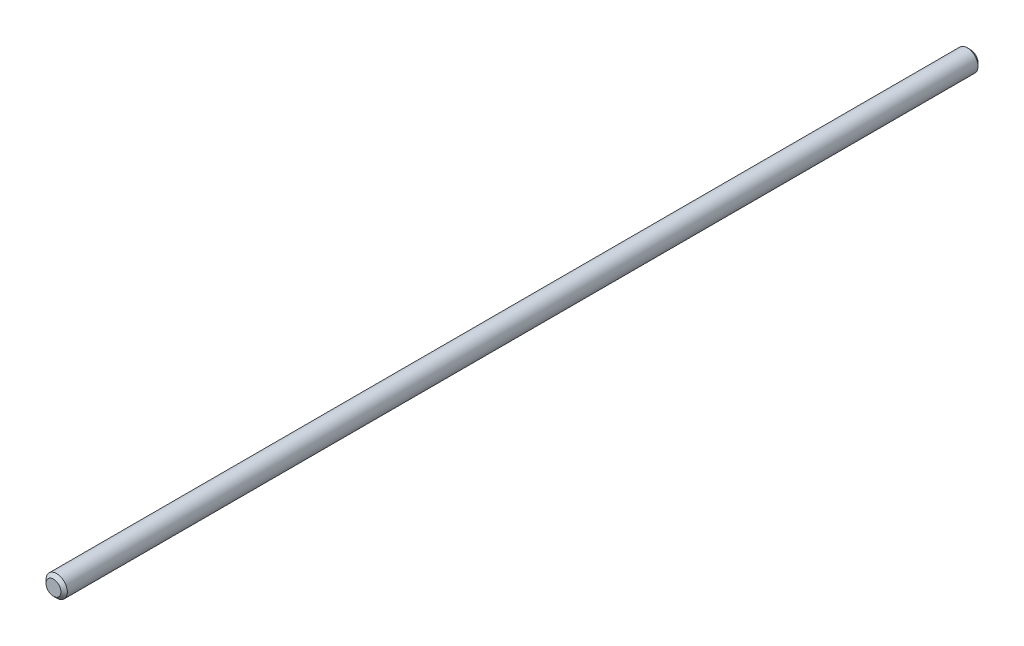
ISO-10303-21;
HEADER;
FILE_DESCRIPTION(('STEP AP214'),'2;1');
FILE_NAME('part.step','',(''),(''),'','','');
FILE_SCHEMA(('AUTOMOTIVE_DESIGN { 1 0 10303 214 1 1 1 1 }'));
ENDSEC;
DATA;
#1=APPLICATION_CONTEXT('core data for automotive mechanical design processes');
#2=APPLICATION_PROTOCOL_DEFINITION('international standard','automotive_design',2000,#1);
#3=PRODUCT_CONTEXT('',#1,'mechanical');
#4=PRODUCT('Part','Part','',(#3));
#5=PRODUCT_RELATED_PRODUCT_CATEGORY('part','',(#4));
#6=PRODUCT_DEFINITION_FORMATION('','',#4);
#7=PRODUCT_DEFINITION_CONTEXT('part definition',#1,'design');
#8=PRODUCT_DEFINITION('design','',#6,#7);
#9=PRODUCT_DEFINITION_SHAPE('','',#8);
#10=(LENGTH_UNIT() NAMED_UNIT(*) SI_UNIT(.MILLI.,.METRE.));
#11=(NAMED_UNIT(*) PLANE_ANGLE_UNIT() SI_UNIT($,.RADIAN.));
#12=(NAMED_UNIT(*) SI_UNIT($,.STERADIAN.) SOLID_ANGLE_UNIT());
#13=UNCERTAINTY_MEASURE_WITH_UNIT(LENGTH_MEASURE(1.E-05),#10,'distance_accuracy_value','');
#14=(GEOMETRIC_REPRESENTATION_CONTEXT(3) GLOBAL_UNCERTAINTY_ASSIGNED_CONTEXT((#13)) GLOBAL_UNIT_ASSIGNED_CONTEXT((#10,
#11,#12)) REPRESENTATION_CONTEXT('',''));
#15=CARTESIAN_POINT('',(0.,0.,0.));
#16=DIRECTION('',(0.,0.,1.));
#17=DIRECTION('',(1.,0.,0.));
#18=AXIS2_PLACEMENT_3D('',#15,#16,#17);
#19=CARTESIAN_POINT('',(0.,0.,136.525));
#20=DIRECTION('',(0.,0.,-1.));
#21=DIRECTION('',(-1.,0.,0.));
#22=AXIS2_PLACEMENT_3D('',#19,#20,#21);
#23=CYLINDRICAL_SURFACE('',#22,3.175);
#24=CARTESIAN_POINT('',(0.,0.,-135.5725));
#25=DIRECTION('',(0.,0.,1.));
#26=DIRECTION('',(1.,0.,0.));
#27=AXIS2_PLACEMENT_3D('',#24,#25,#26);
#28=CIRCLE('',#27,3.175);
#29=CARTESIAN_POINT('',(3.17499999999999,0.,-135.5725));
#30=VERTEX_POINT('',#29);
#31=EDGE_CURVE('E48',#30,#30,#28,.T.);
#32=ORIENTED_EDGE('',*,*,#31,.T.);
#33=EDGE_LOOP('',(#32));
#34=FACE_BOUND('',#33,.T.);
#35=CARTESIAN_POINT('',(0.,0.,135.5725));
#36=DIRECTION('',(0.,0.,1.));
#37=DIRECTION('',(1.,0.,0.));
#38=AXIS2_PLACEMENT_3D('',#35,#36,#37);
#39=CIRCLE('',#38,3.175);
#40=CARTESIAN_POINT('',(3.175,0.,135.5725));
#41=VERTEX_POINT('',#40);
#42=EDGE_CURVE('E52',#41,#41,#39,.F.);
#43=ORIENTED_EDGE('',*,*,#42,.T.);
#44=EDGE_LOOP('',(#43));
#45=FACE_BOUND('',#44,.T.);
#46=ADVANCED_FACE('F37',(#34,#45),#23,.T.);
#47=CARTESIAN_POINT('',(0.,0.,136.525));
#48=DIRECTION('',(0.,0.,1.));
#49=DIRECTION('',(1.,0.,0.));
#50=AXIS2_PLACEMENT_3D('',#47,#48,#49);
#51=PLANE('',#50);
#52=CARTESIAN_POINT('',(0.,0.,136.525));
#53=DIRECTION('',(0.,0.,1.));
#54=DIRECTION('',(1.,0.,0.));
#55=AXIS2_PLACEMENT_3D('',#52,#53,#54);
#56=CIRCLE('',#55,2.22250000000002);
#57=CARTESIAN_POINT('',(2.22250000000002,0.,136.525));
#58=VERTEX_POINT('',#57);
#59=EDGE_CURVE('E10',#58,#58,#56,.T.);
#60=ORIENTED_EDGE('',*,*,#59,.T.);
#61=EDGE_LOOP('',(#60));
#62=FACE_BOUND('',#61,.T.);
#63=ADVANCED_FACE('F68',(#62),#51,.T.);
#64=CARTESIAN_POINT('',(0.,0.,-136.525));
#65=DIRECTION('',(0.,0.,1.));
#66=DIRECTION('',(1.,0.,0.));
#67=AXIS2_PLACEMENT_3D('',#64,#65,#66);
#68=PLANE('',#67);
#69=CARTESIAN_POINT('',(0.,0.,-136.525));
#70=DIRECTION('',(0.,0.,1.));
#71=DIRECTION('',(1.,0.,0.));
#72=AXIS2_PLACEMENT_3D('',#69,#70,#71);
#73=CIRCLE('',#72,2.22250000000002);
#74=CARTESIAN_POINT('',(2.2225,0.,-136.525));
#75=VERTEX_POINT('',#74);
#76=EDGE_CURVE('E44',#75,#75,#73,.F.);
#77=ORIENTED_EDGE('',*,*,#76,.T.);
#78=EDGE_LOOP('',(#77));
#79=FACE_BOUND('',#78,.T.);
#80=ADVANCED_FACE('F65',(#79),#68,.F.);
#81=CARTESIAN_POINT('',(0.,0.,-135.5725));
#82=DIRECTION('',(0.,0.,1.));
#83=DIRECTION('',(1.,0.,0.));
#84=AXIS2_PLACEMENT_3D('',#81,#82,#83);
#85=CONICAL_SURFACE('',#84,3.175,0.785398163397428);
#86=CARTESIAN_POINT('',(2.2225,0.,-136.525));
#87=CARTESIAN_POINT('',(2.23242187500001,0.,-136.515078125));
#88=CARTESIAN_POINT('',(2.24234375,0.,-136.50515625));
#89=CARTESIAN_POINT('',(2.2621875,0.,-136.4853125));
#90=CARTESIAN_POINT('',(2.272109375,0.,-136.475390625));
#91=CARTESIAN_POINT('',(2.291953125,0.,-136.455546875));
#92=CARTESIAN_POINT('',(2.301875,0.,-136.445625));
#93=CARTESIAN_POINT('',(2.32171875,0.,-136.42578125));
#94=CARTESIAN_POINT('',(2.331640625,0.,-136.415859375));
#95=CARTESIAN_POINT('',(2.351484375,0.,-136.396015625));
#96=CARTESIAN_POINT('',(2.36140625,0.,-136.38609375));
#97=CARTESIAN_POINT('',(2.38125,0.,-136.36625));
#98=CARTESIAN_POINT('',(2.391171875,0.,-136.356328125));
#99=CARTESIAN_POINT('',(2.411015625,0.,-136.336484375));
#100=CARTESIAN_POINT('',(2.4209375,0.,-136.3265625));
#101=CARTESIAN_POINT('',(2.44078125,0.,-136.30671875));
#102=CARTESIAN_POINT('',(2.450703125,0.,-136.296796875));
#103=CARTESIAN_POINT('',(2.470546875,0.,-136.276953125));
#104=CARTESIAN_POINT('',(2.48046875,0.,-136.26703125));
#105=CARTESIAN_POINT('',(2.5003125,0.,-136.2471875));
#106=CARTESIAN_POINT('',(2.51023437499999,0.,-136.237265625));
#107=CARTESIAN_POINT('',(2.530078125,0.,-136.217421875));
#108=CARTESIAN_POINT('',(2.54,0.,-136.2075));
#109=CARTESIAN_POINT('',(2.55984375,0.,-136.18765625));
#110=CARTESIAN_POINT('',(2.569765625,0.,-136.177734375));
#111=CARTESIAN_POINT('',(2.589609375,0.,-136.157890625));
#112=CARTESIAN_POINT('',(2.59953124999999,0.,-136.14796875));
#113=CARTESIAN_POINT('',(2.61937499999999,0.,-136.128125));
#114=CARTESIAN_POINT('',(2.629296875,0.,-136.118203125));
#115=CARTESIAN_POINT('',(2.649140625,0.,-136.098359375));
#116=CARTESIAN_POINT('',(2.65906249999999,0.,-136.0884375));
#117=CARTESIAN_POINT('',(2.67890624999999,0.,-136.06859375));
#118=CARTESIAN_POINT('',(2.688828125,0.,-136.058671875));
#119=CARTESIAN_POINT('',(2.708671875,0.,-136.038828125));
#120=CARTESIAN_POINT('',(2.71859375,0.,-136.02890625));
#121=CARTESIAN_POINT('',(2.73843749999999,0.,-136.0090625));
#122=CARTESIAN_POINT('',(2.74835937499999,0.,-135.999140625));
#123=CARTESIAN_POINT('',(2.76820312499999,0.,-135.979296875));
#124=CARTESIAN_POINT('',(2.77812499999999,0.,-135.969375));
#125=CARTESIAN_POINT('',(2.79796875,0.,-135.94953125));
#126=CARTESIAN_POINT('',(2.80789062499999,0.,-135.939609375));
#127=CARTESIAN_POINT('',(2.82773437499999,0.,-135.919765625));
#128=CARTESIAN_POINT('',(2.83765624999999,0.,-135.90984375));
#129=CARTESIAN_POINT('',(2.85749999999999,0.,-135.89));
#130=CARTESIAN_POINT('',(2.86742187499999,0.,-135.880078125));
#131=CARTESIAN_POINT('',(2.887265625,0.,-135.860234375));
#132=CARTESIAN_POINT('',(2.89718749999999,0.,-135.8503125));
#133=CARTESIAN_POINT('',(2.91703124999999,0.,-135.83046875));
#134=CARTESIAN_POINT('',(2.92695312499999,0.,-135.820546875));
#135=CARTESIAN_POINT('',(2.94679687499999,0.,-135.800703125));
#136=CARTESIAN_POINT('',(2.95671874999999,0.,-135.79078125));
#137=CARTESIAN_POINT('',(2.97656249999999,0.,-135.7709375));
#138=CARTESIAN_POINT('',(2.98648437499999,0.,-135.761015625));
#139=CARTESIAN_POINT('',(3.00632812499999,0.,-135.741171875));
#140=CARTESIAN_POINT('',(3.01624999999999,0.,-135.73125));
#141=CARTESIAN_POINT('',(3.03609374999999,0.,-135.71140625));
#142=CARTESIAN_POINT('',(3.04601562499999,0.,-135.701484375));
#143=CARTESIAN_POINT('',(3.06585937499999,0.,-135.681640625));
#144=CARTESIAN_POINT('',(3.07578124999999,0.,-135.67171875));
#145=CARTESIAN_POINT('',(3.09562499999999,0.,-135.651875));
#146=CARTESIAN_POINT('',(3.10554687499999,0.,-135.641953125));
#147=CARTESIAN_POINT('',(3.12539062499999,0.,-135.622109375));
#148=CARTESIAN_POINT('',(3.13531249999999,0.,-135.6121875));
#149=CARTESIAN_POINT('',(3.15515624999999,0.,-135.59234375));
#150=CARTESIAN_POINT('',(3.16507812499998,0.,-135.582421875));
#151=CARTESIAN_POINT('',(3.17499999999999,0.,-135.5725));
#152=B_SPLINE_CURVE_WITH_KNOTS('',3,(#86,#87,#88,#89,#90,#91,#92,#93,#94,#95,#96,#97,#98,#99,
#100,#101,#102,#103,#104,#105,#106,#107,#108,#109,#110,#111,#112,#113,#114,#115,#116,#117,#118,
#119,#120,#121,#122,#123,#124,#125,#126,#127,#128,#129,#130,#131,#132,#133,#134,#135,#136,#137,
#138,#139,#140,#141,#142,#143,#144,#145,#146,#147,#148,#149,#150,#151),.UNSPECIFIED.,.F.,.F.,(4,
2,2,2,2,2,2,2,2,2,2,2,2,2,2,2,2,2,2,2,2,2,2,2,2,2,2,2,2,2,2,2,4),(0.,0.0420949505675194,
0.0841899011350385,0.126284851702538,0.168379802270057,0.210474752837576,0.252569703405076,
0.294664653972595,0.336759604540095,0.378854555107614,0.420949505675133,0.463044456242633,
0.505139406810152,0.547234357377671,0.589329307945171,0.63142425851269,0.67351920908019,
0.715614159647709,0.757709110215228,0.799804060782727,0.841899011350247,0.883993961917766,
0.926088912485265,0.968183863052785,1.0102788136203,1.0523737641878,1.09446871475532,
1.13656366532282,1.17865861589034,1.22075356645786,1.26284851702536,1.30494346759288,
1.3470384181604),.UNSPECIFIED.);
#153=EDGE_CURVE('BSEAM61',#75,#30,#152,.T.);
#154=ORIENTED_EDGE('',*,*,#76,.F.);
#155=ORIENTED_EDGE('',*,*,#31,.F.);
#156=ORIENTED_EDGE('',*,*,#153,.T.);
#157=ORIENTED_EDGE('',*,*,#153,.F.);
#158=EDGE_LOOP('',(#154,#156,#155,#157));
#159=FACE_BOUND('',#158,.T.);
#160=ADVANCED_FACE('F61',(#159),#85,.T.);
#161=CARTESIAN_POINT('',(0.,0.,136.525));
#162=DIRECTION('',(0.,0.,-1.));
#163=DIRECTION('',(-1.,0.,0.));
#164=AXIS2_PLACEMENT_3D('',#161,#162,#163);
#165=CONICAL_SURFACE('',#164,2.22250000000002,0.785398163397458);
#166=ORIENTED_EDGE('',*,*,#42,.F.);
#167=EDGE_LOOP('',(#166));
#168=FACE_BOUND('',#167,.T.);
#169=ORIENTED_EDGE('',*,*,#59,.F.);
#170=EDGE_LOOP('',(#169));
#171=FACE_BOUND('',#170,.T.);
#172=ADVANCED_FACE('F39',(#168,#171),#165,.T.);
#173=CLOSED_SHELL('',(#46,#63,#80,#160,#172));
#174=MANIFOLD_SOLID_BREP('B2',#173);
#175=ADVANCED_BREP_SHAPE_REPRESENTATION('',(#18,#174),#14);
#176=SHAPE_DEFINITION_REPRESENTATION(#9,#175);
ENDSEC;
END-ISO-10303-21;
